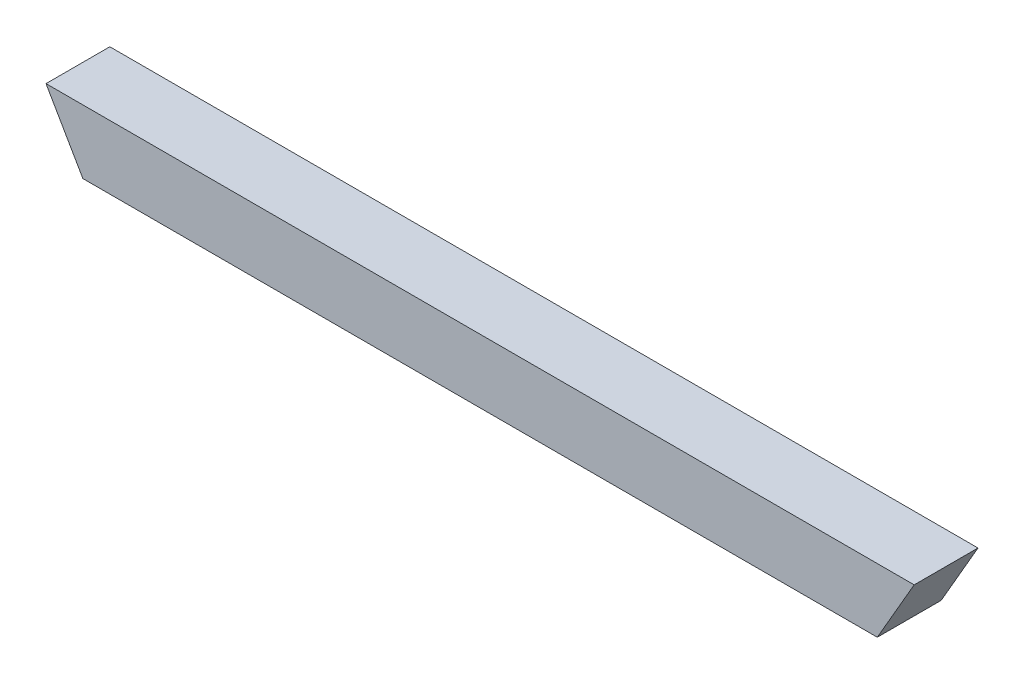
ISO-10303-21;
HEADER;
FILE_DESCRIPTION(('STEP AP214'),'2;1');
FILE_NAME('part.step','',(''),(''),'','','');
FILE_SCHEMA(('AUTOMOTIVE_DESIGN { 1 0 10303 214 1 1 1 1 }'));
ENDSEC;
DATA;
#1=APPLICATION_CONTEXT('core data for automotive mechanical design processes');
#2=APPLICATION_PROTOCOL_DEFINITION('international standard','automotive_design',2000,#1);
#3=PRODUCT_CONTEXT('',#1,'mechanical');
#4=PRODUCT('Part','Part','',(#3));
#5=PRODUCT_RELATED_PRODUCT_CATEGORY('part','',(#4));
#6=PRODUCT_DEFINITION_FORMATION('','',#4);
#7=PRODUCT_DEFINITION_CONTEXT('part definition',#1,'design');
#8=PRODUCT_DEFINITION('design','',#6,#7);
#9=PRODUCT_DEFINITION_SHAPE('','',#8);
#10=(LENGTH_UNIT() NAMED_UNIT(*) SI_UNIT(.MILLI.,.METRE.));
#11=(NAMED_UNIT(*) PLANE_ANGLE_UNIT() SI_UNIT($,.RADIAN.));
#12=(NAMED_UNIT(*) SI_UNIT($,.STERADIAN.) SOLID_ANGLE_UNIT());
#13=UNCERTAINTY_MEASURE_WITH_UNIT(LENGTH_MEASURE(1.E-05),#10,'distance_accuracy_value','');
#14=(GEOMETRIC_REPRESENTATION_CONTEXT(3) GLOBAL_UNCERTAINTY_ASSIGNED_CONTEXT((#13)) GLOBAL_UNIT_ASSIGNED_CONTEXT((#10,
#11,#12)) REPRESENTATION_CONTEXT('',''));
#15=CARTESIAN_POINT('',(0.,0.,0.));
#16=DIRECTION('',(0.,0.,1.));
#17=DIRECTION('',(1.,0.,0.));
#18=AXIS2_PLACEMENT_3D('',#15,#16,#17);
#19=CARTESIAN_POINT('',(-56.1116666666668,14.8333333333334,20.));
#20=DIRECTION('',(0.865875491773361,0.500259565372058,0.));
#21=DIRECTION('',(-0.500259565372058,0.865875491773361,0.));
#22=AXIS2_PLACEMENT_3D('',#19,#20,#21);
#23=PLANE('',#22);
#24=DIRECTION('',(0.500259565372058,-0.865875491773361,0.));
#25=VECTOR('',#24,1.);
#26=CARTESIAN_POINT('',(-56.1116666666668,14.8333333333334,0.));
#27=LINE('',#26,#25);
#28=CARTESIAN_POINT('',(-67.6666666666667,34.8333333333334,0.));
#29=VERTEX_POINT('',#28);
#30=CARTESIAN_POINT('',(-56.1116666666668,14.8333333333334,0.));
#31=VERTEX_POINT('',#30);
#32=EDGE_CURVE('E96',#29,#31,#27,.T.);
#33=ORIENTED_EDGE('',*,*,#32,.T.);
#34=DIRECTION('',(0.,0.,-1.));
#35=VECTOR('',#34,1.);
#36=CARTESIAN_POINT('',(-56.1116666666668,14.8333333333334,20.));
#37=LINE('',#36,#35);
#38=CARTESIAN_POINT('',(-56.1116666666668,14.8333333333334,20.));
#39=VERTEX_POINT('',#38);
#40=EDGE_CURVE('E11',#39,#31,#37,.T.);
#41=ORIENTED_EDGE('',*,*,#40,.F.);
#42=DIRECTION('',(0.500259565372058,-0.865875491773361,0.));
#43=VECTOR('',#42,1.);
#44=CARTESIAN_POINT('',(-56.1116666666668,14.8333333333334,20.));
#45=LINE('',#44,#43);
#46=CARTESIAN_POINT('',(-67.6666666666667,34.8333333333334,20.));
#47=VERTEX_POINT('',#46);
#48=EDGE_CURVE('E84',#47,#39,#45,.T.);
#49=ORIENTED_EDGE('',*,*,#48,.F.);
#50=DIRECTION('',(0.,0.,-1.));
#51=VECTOR('',#50,1.);
#52=CARTESIAN_POINT('',(-67.6666666666667,34.8333333333334,20.));
#53=LINE('',#52,#51);
#54=EDGE_CURVE('E92',#47,#29,#53,.T.);
#55=ORIENTED_EDGE('',*,*,#54,.T.);
#56=EDGE_LOOP('',(#33,#41,#49,#55));
#57=FACE_BOUND('',#56,.T.);
#58=ADVANCED_FACE('F33',(#57),#23,.F.);
#59=CARTESIAN_POINT('',(192.848333333333,14.8333333333334,20.));
#60=DIRECTION('',(0.,1.,0.));
#61=DIRECTION('',(0.,0.,1.));
#62=AXIS2_PLACEMENT_3D('',#59,#60,#61);
#63=PLANE('',#62);
#64=DIRECTION('',(1.,0.,0.));
#65=VECTOR('',#64,1.);
#66=CARTESIAN_POINT('',(192.848333333333,14.8333333333334,0.));
#67=LINE('',#66,#65);
#68=CARTESIAN_POINT('',(192.848333333333,14.8333333333334,0.));
#69=VERTEX_POINT('',#68);
#70=EDGE_CURVE('E88',#31,#69,#67,.T.);
#71=ORIENTED_EDGE('',*,*,#70,.T.);
#72=DIRECTION('',(0.,0.,-1.));
#73=VECTOR('',#72,1.);
#74=CARTESIAN_POINT('',(192.848333333333,14.8333333333334,20.));
#75=LINE('',#74,#73);
#76=CARTESIAN_POINT('',(192.848333333333,14.8333333333334,20.));
#77=VERTEX_POINT('',#76);
#78=EDGE_CURVE('E41',#77,#69,#75,.T.);
#79=ORIENTED_EDGE('',*,*,#78,.F.);
#80=DIRECTION('',(1.,0.,0.));
#81=VECTOR('',#80,1.);
#82=CARTESIAN_POINT('',(192.848333333333,14.8333333333334,20.));
#83=LINE('',#82,#81);
#84=EDGE_CURVE('E79',#39,#77,#83,.T.);
#85=ORIENTED_EDGE('',*,*,#84,.F.);
#86=ORIENTED_EDGE('',*,*,#40,.T.);
#87=EDGE_LOOP('',(#71,#79,#85,#86));
#88=FACE_BOUND('',#87,.T.);
#89=ADVANCED_FACE('F87',(#88),#63,.F.);
#90=CARTESIAN_POINT('',(204.403333333333,34.8333333333334,20.));
#91=DIRECTION('',(-0.865875491773361,0.500259565372058,0.));
#92=DIRECTION('',(-0.500259565372058,-0.865875491773361,0.));
#93=AXIS2_PLACEMENT_3D('',#90,#91,#92);
#94=PLANE('',#93);
#95=DIRECTION('',(0.500259565372058,0.865875491773361,0.));
#96=VECTOR('',#95,1.);
#97=CARTESIAN_POINT('',(204.403333333333,34.8333333333334,0.));
#98=LINE('',#97,#96);
#99=CARTESIAN_POINT('',(204.403333333333,34.8333333333334,0.));
#100=VERTEX_POINT('',#99);
#101=EDGE_CURVE('E66',#69,#100,#98,.T.);
#102=ORIENTED_EDGE('',*,*,#101,.T.);
#103=DIRECTION('',(0.,0.,-1.));
#104=VECTOR('',#103,1.);
#105=CARTESIAN_POINT('',(204.403333333333,34.8333333333334,20.));
#106=LINE('',#105,#104);
#107=CARTESIAN_POINT('',(204.403333333333,34.8333333333334,20.));
#108=VERTEX_POINT('',#107);
#109=EDGE_CURVE('E89',#108,#100,#106,.T.);
#110=ORIENTED_EDGE('',*,*,#109,.F.);
#111=DIRECTION('',(0.500259565372058,0.865875491773361,0.));
#112=VECTOR('',#111,1.);
#113=CARTESIAN_POINT('',(204.403333333333,34.8333333333334,20.));
#114=LINE('',#113,#112);
#115=EDGE_CURVE('E82',#77,#108,#114,.T.);
#116=ORIENTED_EDGE('',*,*,#115,.F.);
#117=ORIENTED_EDGE('',*,*,#78,.T.);
#118=EDGE_LOOP('',(#102,#110,#116,#117));
#119=FACE_BOUND('',#118,.T.);
#120=ADVANCED_FACE('F90',(#119),#94,.F.);
#121=CARTESIAN_POINT('',(-67.6666666666667,34.8333333333334,20.));
#122=DIRECTION('',(0.,-1.,0.));
#123=DIRECTION('',(0.,0.,-1.));
#124=AXIS2_PLACEMENT_3D('',#121,#122,#123);
#125=PLANE('',#124);
#126=DIRECTION('',(-1.,0.,0.));
#127=VECTOR('',#126,1.);
#128=CARTESIAN_POINT('',(-67.6666666666667,34.8333333333334,0.));
#129=LINE('',#128,#127);
#130=EDGE_CURVE('E72',#100,#29,#129,.T.);
#131=ORIENTED_EDGE('',*,*,#130,.T.);
#132=ORIENTED_EDGE('',*,*,#54,.F.);
#133=DIRECTION('',(-1.,0.,0.));
#134=VECTOR('',#133,1.);
#135=CARTESIAN_POINT('',(-67.6666666666667,34.8333333333334,20.));
#136=LINE('',#135,#134);
#137=EDGE_CURVE('E49',#108,#47,#136,.T.);
#138=ORIENTED_EDGE('',*,*,#137,.F.);
#139=ORIENTED_EDGE('',*,*,#109,.T.);
#140=EDGE_LOOP('',(#131,#132,#138,#139));
#141=FACE_BOUND('',#140,.T.);
#142=ADVANCED_FACE('F103',(#141),#125,.F.);
#143=CARTESIAN_POINT('',(0.,0.,20.));
#144=DIRECTION('',(0.,0.,1.));
#145=DIRECTION('',(1.,0.,0.));
#146=AXIS2_PLACEMENT_3D('',#143,#144,#145);
#147=PLANE('',#146);
#148=ORIENTED_EDGE('',*,*,#48,.T.);
#149=ORIENTED_EDGE('',*,*,#84,.T.);
#150=ORIENTED_EDGE('',*,*,#115,.T.);
#151=ORIENTED_EDGE('',*,*,#137,.T.);
#152=EDGE_LOOP('',(#148,#149,#150,#151));
#153=FACE_BOUND('',#152,.T.);
#154=ADVANCED_FACE('F80',(#153),#147,.T.);
#155=CARTESIAN_POINT('',(0.,0.,0.));
#156=DIRECTION('',(0.,0.,1.));
#157=DIRECTION('',(1.,0.,0.));
#158=AXIS2_PLACEMENT_3D('',#155,#156,#157);
#159=PLANE('',#158);
#160=ORIENTED_EDGE('',*,*,#32,.F.);
#161=ORIENTED_EDGE('',*,*,#130,.F.);
#162=ORIENTED_EDGE('',*,*,#101,.F.);
#163=ORIENTED_EDGE('',*,*,#70,.F.);
#164=EDGE_LOOP('',(#160,#161,#162,#163));
#165=FACE_BOUND('',#164,.T.);
#166=ADVANCED_FACE('F106',(#165),#159,.F.);
#167=CLOSED_SHELL('',(#58,#89,#120,#142,#154,#166));
#168=MANIFOLD_SOLID_BREP('B2',#167);
#169=ADVANCED_BREP_SHAPE_REPRESENTATION('',(#18,#168),#14);
#170=SHAPE_DEFINITION_REPRESENTATION(#9,#169);
ENDSEC;
END-ISO-10303-21;
